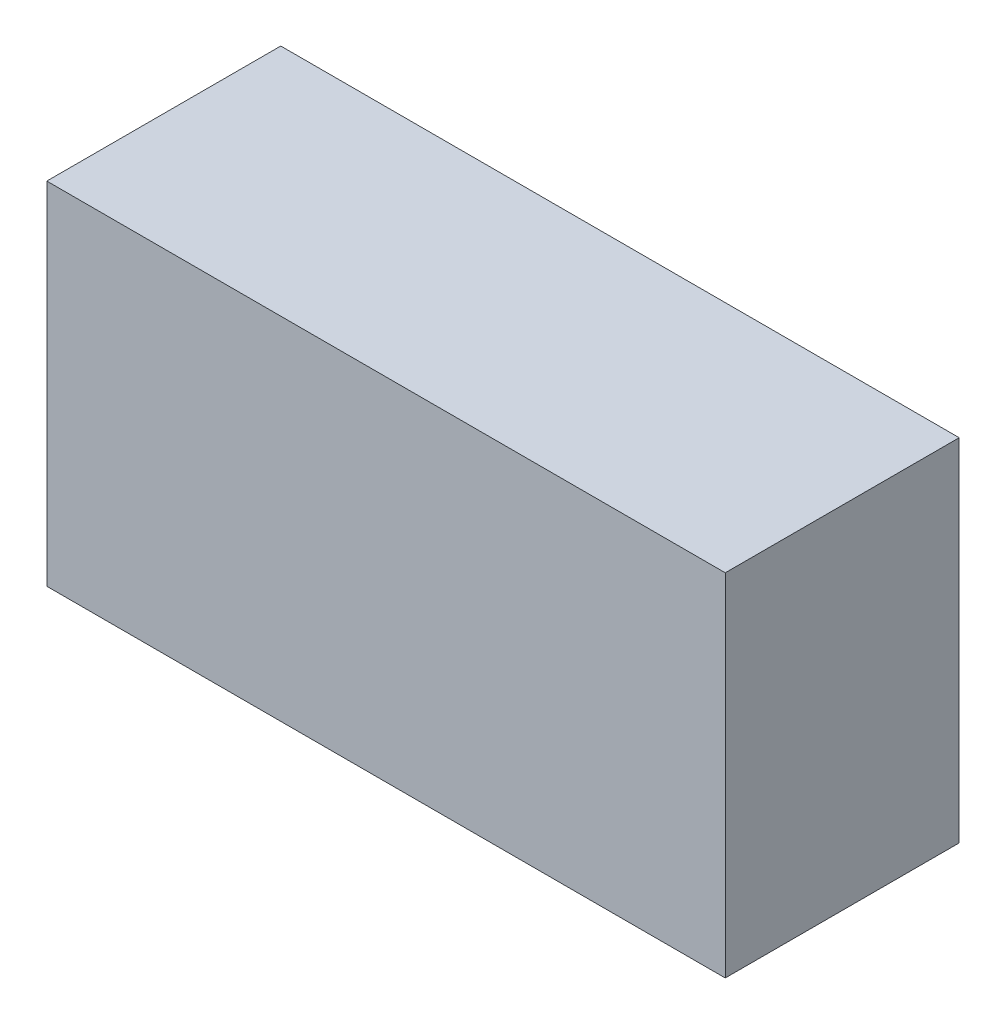
ISO-10303-21;
HEADER;
FILE_DESCRIPTION(('STEP AP214'),'2;1');
FILE_NAME('part.step','',(''),(''),'','','');
FILE_SCHEMA(('AUTOMOTIVE_DESIGN { 1 0 10303 214 1 1 1 1 }'));
ENDSEC;
DATA;
#1=APPLICATION_CONTEXT('core data for automotive mechanical design processes');
#2=APPLICATION_PROTOCOL_DEFINITION('international standard','automotive_design',2000,#1);
#3=PRODUCT_CONTEXT('',#1,'mechanical');
#4=PRODUCT('Part','Part','',(#3));
#5=PRODUCT_RELATED_PRODUCT_CATEGORY('part','',(#4));
#6=PRODUCT_DEFINITION_FORMATION('','',#4);
#7=PRODUCT_DEFINITION_CONTEXT('part definition',#1,'design');
#8=PRODUCT_DEFINITION('design','',#6,#7);
#9=PRODUCT_DEFINITION_SHAPE('','',#8);
#10=(LENGTH_UNIT() NAMED_UNIT(*) SI_UNIT(.MILLI.,.METRE.));
#11=(NAMED_UNIT(*) PLANE_ANGLE_UNIT() SI_UNIT($,.RADIAN.));
#12=(NAMED_UNIT(*) SI_UNIT($,.STERADIAN.) SOLID_ANGLE_UNIT());
#13=UNCERTAINTY_MEASURE_WITH_UNIT(LENGTH_MEASURE(1.E-05),#10,'distance_accuracy_value','');
#14=(GEOMETRIC_REPRESENTATION_CONTEXT(3) GLOBAL_UNCERTAINTY_ASSIGNED_CONTEXT((#13)) GLOBAL_UNIT_ASSIGNED_CONTEXT((#10,
#11,#12)) REPRESENTATION_CONTEXT('',''));
#15=CARTESIAN_POINT('',(0.,0.,0.));
#16=DIRECTION('',(0.,0.,1.));
#17=DIRECTION('',(1.,0.,0.));
#18=AXIS2_PLACEMENT_3D('',#15,#16,#17);
#19=CARTESIAN_POINT('',(-29.,-15.,-20.));
#20=DIRECTION('',(-1.,0.,0.));
#21=DIRECTION('',(0.,0.,1.));
#22=AXIS2_PLACEMENT_3D('',#19,#20,#21);
#23=PLANE('',#22);
#24=DIRECTION('',(0.,-1.,0.));
#25=VECTOR('',#24,1.);
#26=CARTESIAN_POINT('',(-29.,-15.,0.));
#27=LINE('',#26,#25);
#28=CARTESIAN_POINT('',(-29.,15.,0.));
#29=VERTEX_POINT('',#28);
#30=CARTESIAN_POINT('',(-29.,-15.,0.));
#31=VERTEX_POINT('',#30);
#32=EDGE_CURVE('E103',#29,#31,#27,.T.);
#33=ORIENTED_EDGE('',*,*,#32,.F.);
#34=DIRECTION('',(0.,0.,1.));
#35=VECTOR('',#34,1.);
#36=CARTESIAN_POINT('',(-29.,15.,-20.));
#37=LINE('',#36,#35);
#38=CARTESIAN_POINT('',(-29.,15.,-20.));
#39=VERTEX_POINT('',#38);
#40=EDGE_CURVE('E11',#39,#29,#37,.T.);
#41=ORIENTED_EDGE('',*,*,#40,.F.);
#42=DIRECTION('',(0.,-1.,0.));
#43=VECTOR('',#42,1.);
#44=CARTESIAN_POINT('',(-29.,-15.,-20.));
#45=LINE('',#44,#43);
#46=CARTESIAN_POINT('',(-29.,-15.,-20.));
#47=VERTEX_POINT('',#46);
#48=EDGE_CURVE('E97',#39,#47,#45,.T.);
#49=ORIENTED_EDGE('',*,*,#48,.T.);
#50=DIRECTION('',(0.,0.,1.));
#51=VECTOR('',#50,1.);
#52=CARTESIAN_POINT('',(-29.,-15.,-20.));
#53=LINE('',#52,#51);
#54=EDGE_CURVE('E42',#47,#31,#53,.T.);
#55=ORIENTED_EDGE('',*,*,#54,.T.);
#56=EDGE_LOOP('',(#33,#41,#49,#55));
#57=FACE_BOUND('',#56,.T.);
#58=ADVANCED_FACE('F39',(#57),#23,.T.);
#59=CARTESIAN_POINT('',(-29.,15.,-20.));
#60=DIRECTION('',(0.,1.,0.));
#61=DIRECTION('',(0.,0.,1.));
#62=AXIS2_PLACEMENT_3D('',#59,#60,#61);
#63=PLANE('',#62);
#64=DIRECTION('',(-1.,0.,0.));
#65=VECTOR('',#64,1.);
#66=CARTESIAN_POINT('',(-29.,15.,0.));
#67=LINE('',#66,#65);
#68=CARTESIAN_POINT('',(29.,15.,0.));
#69=VERTEX_POINT('',#68);
#70=EDGE_CURVE('E99',#69,#29,#67,.T.);
#71=ORIENTED_EDGE('',*,*,#70,.F.);
#72=DIRECTION('',(0.,0.,1.));
#73=VECTOR('',#72,1.);
#74=CARTESIAN_POINT('',(29.,15.,-20.));
#75=LINE('',#74,#73);
#76=CARTESIAN_POINT('',(29.,15.,-20.));
#77=VERTEX_POINT('',#76);
#78=EDGE_CURVE('E48',#77,#69,#75,.T.);
#79=ORIENTED_EDGE('',*,*,#78,.F.);
#80=DIRECTION('',(-1.,0.,0.));
#81=VECTOR('',#80,1.);
#82=CARTESIAN_POINT('',(-29.,15.,-20.));
#83=LINE('',#82,#81);
#84=EDGE_CURVE('E94',#77,#39,#83,.T.);
#85=ORIENTED_EDGE('',*,*,#84,.T.);
#86=ORIENTED_EDGE('',*,*,#40,.T.);
#87=EDGE_LOOP('',(#71,#79,#85,#86));
#88=FACE_BOUND('',#87,.T.);
#89=ADVANCED_FACE('F113',(#88),#63,.T.);
#90=CARTESIAN_POINT('',(29.,-15.,-20.));
#91=DIRECTION('',(1.,0.,0.));
#92=DIRECTION('',(0.,0.,-1.));
#93=AXIS2_PLACEMENT_3D('',#90,#91,#92);
#94=PLANE('',#93);
#95=DIRECTION('',(0.,1.,0.));
#96=VECTOR('',#95,1.);
#97=CARTESIAN_POINT('',(29.,-15.,0.));
#98=LINE('',#97,#96);
#99=CARTESIAN_POINT('',(29.,-15.,0.));
#100=VERTEX_POINT('',#99);
#101=EDGE_CURVE('E89',#100,#69,#98,.T.);
#102=ORIENTED_EDGE('',*,*,#101,.F.);
#103=DIRECTION('',(0.,0.,1.));
#104=VECTOR('',#103,1.);
#105=CARTESIAN_POINT('',(29.,-15.,-20.));
#106=LINE('',#105,#104);
#107=CARTESIAN_POINT('',(29.,-15.,-20.));
#108=VERTEX_POINT('',#107);
#109=EDGE_CURVE('E84',#108,#100,#106,.T.);
#110=ORIENTED_EDGE('',*,*,#109,.F.);
#111=DIRECTION('',(0.,1.,0.));
#112=VECTOR('',#111,1.);
#113=CARTESIAN_POINT('',(29.,-15.,-20.));
#114=LINE('',#113,#112);
#115=EDGE_CURVE('E87',#108,#77,#114,.T.);
#116=ORIENTED_EDGE('',*,*,#115,.T.);
#117=ORIENTED_EDGE('',*,*,#78,.T.);
#118=EDGE_LOOP('',(#102,#110,#116,#117));
#119=FACE_BOUND('',#118,.T.);
#120=ADVANCED_FACE('F86',(#119),#94,.T.);
#121=CARTESIAN_POINT('',(-29.,-15.,-20.));
#122=DIRECTION('',(0.,-1.,0.));
#123=DIRECTION('',(0.,0.,-1.));
#124=AXIS2_PLACEMENT_3D('',#121,#122,#123);
#125=PLANE('',#124);
#126=DIRECTION('',(1.,0.,0.));
#127=VECTOR('',#126,1.);
#128=CARTESIAN_POINT('',(-29.,-15.,0.));
#129=LINE('',#128,#127);
#130=EDGE_CURVE('E106',#31,#100,#129,.T.);
#131=ORIENTED_EDGE('',*,*,#130,.F.);
#132=ORIENTED_EDGE('',*,*,#54,.F.);
#133=DIRECTION('',(1.,0.,0.));
#134=VECTOR('',#133,1.);
#135=CARTESIAN_POINT('',(-29.,-15.,-20.));
#136=LINE('',#135,#134);
#137=EDGE_CURVE('E93',#47,#108,#136,.T.);
#138=ORIENTED_EDGE('',*,*,#137,.T.);
#139=ORIENTED_EDGE('',*,*,#109,.T.);
#140=EDGE_LOOP('',(#131,#132,#138,#139));
#141=FACE_BOUND('',#140,.T.);
#142=ADVANCED_FACE('F96',(#141),#125,.T.);
#143=CARTESIAN_POINT('',(0.,0.,-20.));
#144=DIRECTION('',(0.,0.,-1.));
#145=DIRECTION('',(-1.,0.,0.));
#146=AXIS2_PLACEMENT_3D('',#143,#144,#145);
#147=PLANE('',#146);
#148=ORIENTED_EDGE('',*,*,#48,.F.);
#149=ORIENTED_EDGE('',*,*,#84,.F.);
#150=ORIENTED_EDGE('',*,*,#115,.F.);
#151=ORIENTED_EDGE('',*,*,#137,.F.);
#152=EDGE_LOOP('',(#148,#149,#150,#151));
#153=FACE_BOUND('',#152,.T.);
#154=ADVANCED_FACE('F92',(#153),#147,.T.);
#155=CARTESIAN_POINT('',(0.,0.,0.));
#156=DIRECTION('',(0.,0.,-1.));
#157=DIRECTION('',(-1.,0.,0.));
#158=AXIS2_PLACEMENT_3D('',#155,#156,#157);
#159=PLANE('',#158);
#160=ORIENTED_EDGE('',*,*,#32,.T.);
#161=ORIENTED_EDGE('',*,*,#130,.T.);
#162=ORIENTED_EDGE('',*,*,#101,.T.);
#163=ORIENTED_EDGE('',*,*,#70,.T.);
#164=EDGE_LOOP('',(#160,#161,#162,#163));
#165=FACE_BOUND('',#164,.T.);
#166=ADVANCED_FACE('F112',(#165),#159,.F.);
#167=CLOSED_SHELL('',(#58,#89,#120,#142,#154,#166));
#168=MANIFOLD_SOLID_BREP('B2',#167);
#169=ADVANCED_BREP_SHAPE_REPRESENTATION('',(#18,#168),#14);
#170=SHAPE_DEFINITION_REPRESENTATION(#9,#169);
ENDSEC;
END-ISO-10303-21;
